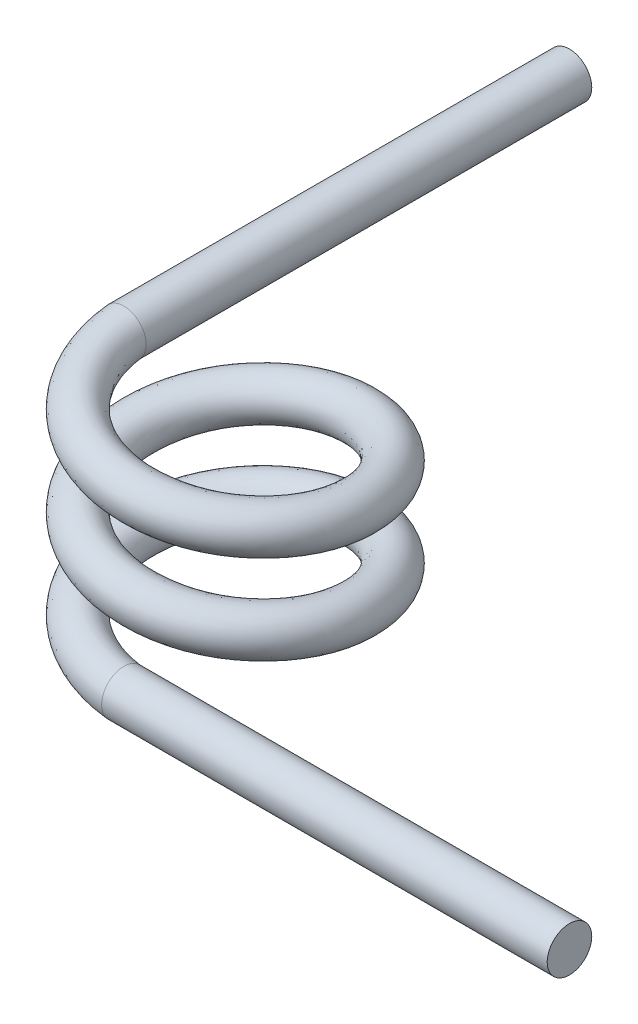
ISO-10303-21;
HEADER;
FILE_DESCRIPTION(('STEP AP214'),'2;1');
FILE_NAME('part.step','',(''),(''),'','','');
FILE_SCHEMA(('AUTOMOTIVE_DESIGN { 1 0 10303 214 1 1 1 1 }'));
ENDSEC;
DATA;
#1=APPLICATION_CONTEXT('core data for automotive mechanical design processes');
#2=APPLICATION_PROTOCOL_DEFINITION('international standard','automotive_design',2000,#1);
#3=PRODUCT_CONTEXT('',#1,'mechanical');
#4=PRODUCT('Part','Part','',(#3));
#5=PRODUCT_RELATED_PRODUCT_CATEGORY('part','',(#4));
#6=PRODUCT_DEFINITION_FORMATION('','',#4);
#7=PRODUCT_DEFINITION_CONTEXT('part definition',#1,'design');
#8=PRODUCT_DEFINITION('design','',#6,#7);
#9=PRODUCT_DEFINITION_SHAPE('','',#8);
#10=(LENGTH_UNIT() NAMED_UNIT(*) SI_UNIT(.MILLI.,.METRE.));
#11=(NAMED_UNIT(*) PLANE_ANGLE_UNIT() SI_UNIT($,.RADIAN.));
#12=(NAMED_UNIT(*) SI_UNIT($,.STERADIAN.) SOLID_ANGLE_UNIT());
#13=UNCERTAINTY_MEASURE_WITH_UNIT(LENGTH_MEASURE(1.E-05),#10,'distance_accuracy_value','');
#14=(GEOMETRIC_REPRESENTATION_CONTEXT(3) GLOBAL_UNCERTAINTY_ASSIGNED_CONTEXT((#13)) GLOBAL_UNIT_ASSIGNED_CONTEXT((#10,
#11,#12)) REPRESENTATION_CONTEXT('',''));
#15=CARTESIAN_POINT('',(0.,0.,0.));
#16=DIRECTION('',(0.,0.,1.));
#17=DIRECTION('',(1.,0.,0.));
#18=AXIS2_PLACEMENT_3D('',#15,#16,#17);
#19=CARTESIAN_POINT('',(0.999999999999999,0.,0.));
#20=CARTESIAN_POINT('',(1.00000000000001,0.0625000000000017,0.414213562373059));
#21=CARTESIAN_POINT('',(0.707106781186572,0.125000000000002,0.707106781186521));
#22=CARTESIAN_POINT('',(0.41421356237313,0.187500000000002,0.999999999999984));
#23=CARTESIAN_POINT('',(0.,0.250000000000002,0.999999999999999));
#24=CARTESIAN_POINT('',(-0.414213562373059,0.312500000000002,1.00000000000001));
#25=CARTESIAN_POINT('',(-0.707106781186521,0.375000000000002,0.707106781186572));
#26=CARTESIAN_POINT('',(-0.999999999999984,0.437500000000002,0.41421356237313));
#27=CARTESIAN_POINT('',(-0.999999999999999,0.500000000000002,0.));
#28=CARTESIAN_POINT('',(-1.00000000000001,0.562500000000002,-0.414213562373059));
#29=CARTESIAN_POINT('',(-0.707106781186572,0.625000000000002,-0.707106781186521));
#30=CARTESIAN_POINT('',(-0.414213562373131,0.687500000000002,-0.999999999999984));
#31=CARTESIAN_POINT('',(0.,0.750000000000002,-0.999999999999999));
#32=CARTESIAN_POINT('',(0.414213562373059,0.812500000000002,-1.00000000000001));
#33=CARTESIAN_POINT('',(0.707106781186521,0.875000000000002,-0.707106781186572));
#34=CARTESIAN_POINT('',(0.999999999999984,0.937500000000002,-0.414213562373131));
#35=CARTESIAN_POINT('',(0.999999999999999,1.,0.));
#36=CARTESIAN_POINT('',(1.00000000000001,1.0625,0.414213562373059));
#37=CARTESIAN_POINT('',(0.707106781186572,1.125,0.707106781186521));
#38=CARTESIAN_POINT('',(0.41421356237313,1.1875,0.999999999999984));
#39=CARTESIAN_POINT('',(0.,1.25,0.999999999999999));
#40=CARTESIAN_POINT('',(-0.414213562373059,1.3125,1.00000000000001));
#41=CARTESIAN_POINT('',(-0.707106781186521,1.375,0.707106781186572));
#42=CARTESIAN_POINT('',(-0.999999999999984,1.4375,0.41421356237313));
#43=CARTESIAN_POINT('',(-0.999999999999999,1.5,0.));
#44=CARTESIAN_POINT('',(-1.00000000000001,1.5625,-0.414213562373059));
#45=CARTESIAN_POINT('',(-0.707106781186572,1.625,-0.707106781186521));
#46=CARTESIAN_POINT('',(-0.414213562373131,1.6875,-0.999999999999984));
#47=CARTESIAN_POINT('',(0.,1.75,-0.999999999999999));
#48=CARTESIAN_POINT('',(0.414213562373059,1.8125,-1.00000000000001));
#49=CARTESIAN_POINT('',(0.707106781186521,1.875,-0.707106781186572));
#50=CARTESIAN_POINT('',(0.999999999999984,1.9375,-0.414213562373131));
#51=CARTESIAN_POINT('',(0.999999999999999,2.,0.));
#52=CARTESIAN_POINT('',(1.00000000000001,2.0625,0.414213562373059));
#53=CARTESIAN_POINT('',(0.707106781186572,2.125,0.707106781186521));
#54=CARTESIAN_POINT('',(0.41421356237313,2.1875,0.999999999999984));
#55=CARTESIAN_POINT('',(0.,2.25,0.999999999999999));
#56=CARTESIAN_POINT('',(-0.414213562373059,2.3125,1.00000000000001));
#57=CARTESIAN_POINT('',(-0.707106781186521,2.375,0.707106781186572));
#58=CARTESIAN_POINT('',(-0.999999999999984,2.4375,0.41421356237313));
#59=CARTESIAN_POINT('',(-0.999999999999999,2.5,0.));
#60=CARTESIAN_POINT('',(0.999999999999999,0.500000000000002,0.));
#61=CARTESIAN_POINT('',(1.00000000000001,0.562500000000002,0.414213562373059));
#62=CARTESIAN_POINT('',(0.707106781186572,0.625000000000002,0.707106781186521));
#63=CARTESIAN_POINT('',(0.41421356237313,0.687500000000002,0.999999999999984));
#64=CARTESIAN_POINT('',(0.,0.750000000000002,0.999999999999999));
#65=CARTESIAN_POINT('',(-0.414213562373059,0.812500000000002,1.00000000000001));
#66=CARTESIAN_POINT('',(-0.707106781186521,0.875000000000002,0.707106781186572));
#67=CARTESIAN_POINT('',(-0.999999999999984,0.937500000000002,0.41421356237313));
#68=CARTESIAN_POINT('',(-0.999999999999999,1.,0.));
#69=CARTESIAN_POINT('',(-1.00000000000001,1.0625,-0.414213562373059));
#70=CARTESIAN_POINT('',(-0.707106781186572,1.125,-0.707106781186521));
#71=CARTESIAN_POINT('',(-0.414213562373131,1.1875,-0.999999999999984));
#72=CARTESIAN_POINT('',(0.,1.25,-0.999999999999999));
#73=CARTESIAN_POINT('',(0.414213562373059,1.3125,-1.00000000000001));
#74=CARTESIAN_POINT('',(0.707106781186521,1.375,-0.707106781186572));
#75=CARTESIAN_POINT('',(0.999999999999984,1.4375,-0.414213562373131));
#76=CARTESIAN_POINT('',(0.999999999999999,1.5,0.));
#77=CARTESIAN_POINT('',(1.00000000000001,1.5625,0.414213562373059));
#78=CARTESIAN_POINT('',(0.707106781186572,1.625,0.707106781186521));
#79=CARTESIAN_POINT('',(0.41421356237313,1.6875,0.999999999999984));
#80=CARTESIAN_POINT('',(0.,1.75,0.999999999999999));
#81=CARTESIAN_POINT('',(-0.414213562373059,1.8125,1.00000000000001));
#82=CARTESIAN_POINT('',(-0.707106781186521,1.875,0.707106781186572));
#83=CARTESIAN_POINT('',(-0.999999999999984,1.9375,0.41421356237313));
#84=CARTESIAN_POINT('',(-0.999999999999999,2.,0.));
#85=CARTESIAN_POINT('',(-1.00000000000001,2.0625,-0.414213562373059));
#86=CARTESIAN_POINT('',(-0.707106781186572,2.125,-0.707106781186521));
#87=CARTESIAN_POINT('',(-0.414213562373131,2.1875,-0.999999999999984));
#88=CARTESIAN_POINT('',(0.,2.25,-0.999999999999999));
#89=CARTESIAN_POINT('',(0.414213562373059,2.3125,-1.00000000000001));
#90=CARTESIAN_POINT('',(0.707106781186521,2.375,-0.707106781186572));
#91=CARTESIAN_POINT('',(0.999999999999984,2.4375,-0.414213562373131));
#92=CARTESIAN_POINT('',(0.999999999999999,2.5,0.));
#93=CARTESIAN_POINT('',(1.00000000000001,2.5625,0.414213562373059));
#94=CARTESIAN_POINT('',(0.707106781186572,2.625,0.707106781186521));
#95=CARTESIAN_POINT('',(0.41421356237313,2.6875,0.999999999999984));
#96=CARTESIAN_POINT('',(0.,2.75,0.999999999999999));
#97=CARTESIAN_POINT('',(-0.414213562373059,2.8125,1.00000000000001));
#98=CARTESIAN_POINT('',(-0.707106781186521,2.875,0.707106781186572));
#99=CARTESIAN_POINT('',(-0.999999999999984,2.9375,0.41421356237313));
#100=CARTESIAN_POINT('',(-0.999999999999999,3.,0.));
#101=CARTESIAN_POINT('',(1.5,0.500000000000002,0.));
#102=CARTESIAN_POINT('',(1.50000000000002,0.562500000000002,0.621320343559591));
#103=CARTESIAN_POINT('',(1.06066017177986,0.625000000000002,1.06066017177978));
#104=CARTESIAN_POINT('',(0.621320343559694,0.687500000000002,1.49999999999998));
#105=CARTESIAN_POINT('',(0.,0.750000000000002,1.5));
#106=CARTESIAN_POINT('',(-0.621320343559591,0.812500000000002,1.50000000000002));
#107=CARTESIAN_POINT('',(-1.06066017177978,0.875000000000002,1.06066017177986));
#108=CARTESIAN_POINT('',(-1.49999999999998,0.937500000000002,0.621320343559694));
#109=CARTESIAN_POINT('',(-1.5,1.,0.));
#110=CARTESIAN_POINT('',(-1.50000000000002,1.0625,-0.62132034355959));
#111=CARTESIAN_POINT('',(-1.06066017177986,1.125,-1.06066017177978));
#112=CARTESIAN_POINT('',(-0.621320343559694,1.1875,-1.49999999999998));
#113=CARTESIAN_POINT('',(0.,1.25,-1.5));
#114=CARTESIAN_POINT('',(0.621320343559591,1.3125,-1.50000000000002));
#115=CARTESIAN_POINT('',(1.06066017177978,1.375,-1.06066017177986));
#116=CARTESIAN_POINT('',(1.49999999999998,1.4375,-0.621320343559695));
#117=CARTESIAN_POINT('',(1.5,1.5,0.));
#118=CARTESIAN_POINT('',(1.50000000000002,1.5625,0.621320343559591));
#119=CARTESIAN_POINT('',(1.06066017177986,1.625,1.06066017177978));
#120=CARTESIAN_POINT('',(0.621320343559694,1.6875,1.49999999999998));
#121=CARTESIAN_POINT('',(0.,1.75,1.5));
#122=CARTESIAN_POINT('',(-0.621320343559591,1.8125,1.50000000000002));
#123=CARTESIAN_POINT('',(-1.06066017177978,1.875,1.06066017177986));
#124=CARTESIAN_POINT('',(-1.49999999999998,1.9375,0.621320343559694));
#125=CARTESIAN_POINT('',(-1.5,2.,0.));
#126=CARTESIAN_POINT('',(-1.50000000000002,2.0625,-0.62132034355959));
#127=CARTESIAN_POINT('',(-1.06066017177986,2.125,-1.06066017177978));
#128=CARTESIAN_POINT('',(-0.621320343559694,2.1875,-1.49999999999998));
#129=CARTESIAN_POINT('',(0.,2.25,-1.5));
#130=CARTESIAN_POINT('',(0.621320343559591,2.3125,-1.50000000000002));
#131=CARTESIAN_POINT('',(1.06066017177978,2.375,-1.06066017177986));
#132=CARTESIAN_POINT('',(1.49999999999998,2.4375,-0.621320343559695));
#133=CARTESIAN_POINT('',(1.5,2.5,0.));
#134=CARTESIAN_POINT('',(1.50000000000002,2.5625,0.621320343559591));
#135=CARTESIAN_POINT('',(1.06066017177986,2.625,1.06066017177978));
#136=CARTESIAN_POINT('',(0.621320343559694,2.6875,1.49999999999998));
#137=CARTESIAN_POINT('',(0.,2.75,1.5));
#138=CARTESIAN_POINT('',(-0.621320343559591,2.8125,1.50000000000002));
#139=CARTESIAN_POINT('',(-1.06066017177978,2.875,1.06066017177986));
#140=CARTESIAN_POINT('',(-1.49999999999998,2.9375,0.621320343559694));
#141=CARTESIAN_POINT('',(-1.5,3.,0.));
#142=CARTESIAN_POINT('',(1.5,0.,0.));
#143=CARTESIAN_POINT('',(1.50000000000002,0.0625000000000018,0.62132034355959));
#144=CARTESIAN_POINT('',(1.06066017177986,0.125000000000002,1.06066017177978));
#145=CARTESIAN_POINT('',(0.621320343559694,0.187500000000002,1.49999999999998));
#146=CARTESIAN_POINT('',(0.,0.250000000000002,1.5));
#147=CARTESIAN_POINT('',(-0.62132034355959,0.312500000000002,1.50000000000002));
#148=CARTESIAN_POINT('',(-1.06066017177978,0.375000000000002,1.06066017177986));
#149=CARTESIAN_POINT('',(-1.49999999999998,0.437500000000002,0.621320343559694));
#150=CARTESIAN_POINT('',(-1.5,0.500000000000002,0.));
#151=CARTESIAN_POINT('',(-1.50000000000002,0.562500000000002,-0.62132034355959));
#152=CARTESIAN_POINT('',(-1.06066017177986,0.625000000000002,-1.06066017177978));
#153=CARTESIAN_POINT('',(-0.621320343559694,0.687500000000002,-1.49999999999998));
#154=CARTESIAN_POINT('',(0.,0.750000000000002,-1.5));
#155=CARTESIAN_POINT('',(0.621320343559591,0.812500000000002,-1.50000000000002));
#156=CARTESIAN_POINT('',(1.06066017177978,0.875000000000002,-1.06066017177986));
#157=CARTESIAN_POINT('',(1.49999999999998,0.937500000000002,-0.621320343559695));
#158=CARTESIAN_POINT('',(1.5,1.,0.));
#159=CARTESIAN_POINT('',(1.50000000000002,1.0625,0.62132034355959));
#160=CARTESIAN_POINT('',(1.06066017177986,1.125,1.06066017177978));
#161=CARTESIAN_POINT('',(0.621320343559694,1.1875,1.49999999999998));
#162=CARTESIAN_POINT('',(0.,1.25,1.5));
#163=CARTESIAN_POINT('',(-0.62132034355959,1.3125,1.50000000000002));
#164=CARTESIAN_POINT('',(-1.06066017177978,1.375,1.06066017177986));
#165=CARTESIAN_POINT('',(-1.49999999999998,1.4375,0.621320343559694));
#166=CARTESIAN_POINT('',(-1.5,1.5,0.));
#167=CARTESIAN_POINT('',(-1.50000000000002,1.5625,-0.62132034355959));
#168=CARTESIAN_POINT('',(-1.06066017177986,1.625,-1.06066017177978));
#169=CARTESIAN_POINT('',(-0.621320343559694,1.6875,-1.49999999999998));
#170=CARTESIAN_POINT('',(0.,1.75,-1.5));
#171=CARTESIAN_POINT('',(0.621320343559591,1.8125,-1.50000000000002));
#172=CARTESIAN_POINT('',(1.06066017177978,1.875,-1.06066017177986));
#173=CARTESIAN_POINT('',(1.49999999999998,1.9375,-0.621320343559695));
#174=CARTESIAN_POINT('',(1.5,2.,0.));
#175=CARTESIAN_POINT('',(1.50000000000002,2.0625,0.62132034355959));
#176=CARTESIAN_POINT('',(1.06066017177986,2.125,1.06066017177978));
#177=CARTESIAN_POINT('',(0.621320343559694,2.1875,1.49999999999998));
#178=CARTESIAN_POINT('',(0.,2.25,1.5));
#179=CARTESIAN_POINT('',(-0.62132034355959,2.3125,1.50000000000002));
#180=CARTESIAN_POINT('',(-1.06066017177978,2.375,1.06066017177986));
#181=CARTESIAN_POINT('',(-1.49999999999998,2.4375,0.621320343559694));
#182=CARTESIAN_POINT('',(-1.5,2.5,0.));
#183=CARTESIAN_POINT('',(1.5,-0.499999999999998,0.));
#184=CARTESIAN_POINT('',(1.50000000000002,-0.437499999999998,0.621320343559591));
#185=CARTESIAN_POINT('',(1.06066017177986,-0.374999999999998,1.06066017177978));
#186=CARTESIAN_POINT('',(0.621320343559694,-0.312499999999998,1.49999999999998));
#187=CARTESIAN_POINT('',(0.,-0.249999999999998,1.5));
#188=CARTESIAN_POINT('',(-0.621320343559591,-0.187499999999998,1.50000000000002));
#189=CARTESIAN_POINT('',(-1.06066017177978,-0.124999999999998,1.06066017177986));
#190=CARTESIAN_POINT('',(-1.49999999999998,-0.0624999999999982,0.621320343559694));
#191=CARTESIAN_POINT('',(-1.5,0.,0.));
#192=CARTESIAN_POINT('',(-1.50000000000002,0.0625000000000019,-0.62132034355959));
#193=CARTESIAN_POINT('',(-1.06066017177986,0.125000000000002,-1.06066017177978));
#194=CARTESIAN_POINT('',(-0.621320343559694,0.187500000000002,-1.49999999999998));
#195=CARTESIAN_POINT('',(0.,0.250000000000002,-1.5));
#196=CARTESIAN_POINT('',(0.621320343559591,0.312500000000002,-1.50000000000002));
#197=CARTESIAN_POINT('',(1.06066017177978,0.375000000000002,-1.06066017177986));
#198=CARTESIAN_POINT('',(1.49999999999998,0.437500000000002,-0.621320343559695));
#199=CARTESIAN_POINT('',(1.5,0.500000000000002,0.));
#200=CARTESIAN_POINT('',(1.50000000000002,0.562500000000002,0.621320343559591));
#201=CARTESIAN_POINT('',(1.06066017177986,0.625000000000002,1.06066017177978));
#202=CARTESIAN_POINT('',(0.621320343559694,0.687500000000002,1.49999999999998));
#203=CARTESIAN_POINT('',(0.,0.750000000000002,1.5));
#204=CARTESIAN_POINT('',(-0.621320343559591,0.812500000000002,1.50000000000002));
#205=CARTESIAN_POINT('',(-1.06066017177978,0.875000000000002,1.06066017177986));
#206=CARTESIAN_POINT('',(-1.49999999999998,0.937500000000002,0.621320343559694));
#207=CARTESIAN_POINT('',(-1.5,1.,0.));
#208=CARTESIAN_POINT('',(-1.50000000000002,1.0625,-0.62132034355959));
#209=CARTESIAN_POINT('',(-1.06066017177986,1.125,-1.06066017177978));
#210=CARTESIAN_POINT('',(-0.621320343559694,1.1875,-1.49999999999998));
#211=CARTESIAN_POINT('',(0.,1.25,-1.5));
#212=CARTESIAN_POINT('',(0.621320343559591,1.3125,-1.50000000000002));
#213=CARTESIAN_POINT('',(1.06066017177978,1.375,-1.06066017177986));
#214=CARTESIAN_POINT('',(1.49999999999998,1.4375,-0.621320343559695));
#215=CARTESIAN_POINT('',(1.5,1.5,0.));
#216=CARTESIAN_POINT('',(1.50000000000002,1.5625,0.621320343559591));
#217=CARTESIAN_POINT('',(1.06066017177986,1.625,1.06066017177978));
#218=CARTESIAN_POINT('',(0.621320343559694,1.6875,1.49999999999998));
#219=CARTESIAN_POINT('',(0.,1.75,1.5));
#220=CARTESIAN_POINT('',(-0.621320343559591,1.8125,1.50000000000002));
#221=CARTESIAN_POINT('',(-1.06066017177978,1.875,1.06066017177986));
#222=CARTESIAN_POINT('',(-1.49999999999998,1.9375,0.621320343559694));
#223=CARTESIAN_POINT('',(-1.5,2.,0.));
#224=CARTESIAN_POINT('',(0.999999999999999,-0.499999999999998,0.));
#225=CARTESIAN_POINT('',(1.00000000000001,-0.437499999999998,0.414213562373059));
#226=CARTESIAN_POINT('',(0.707106781186572,-0.374999999999998,0.707106781186521));
#227=CARTESIAN_POINT('',(0.41421356237313,-0.312499999999998,0.999999999999984));
#228=CARTESIAN_POINT('',(0.,-0.249999999999998,0.999999999999999));
#229=CARTESIAN_POINT('',(-0.414213562373059,-0.187499999999998,1.00000000000001));
#230=CARTESIAN_POINT('',(-0.707106781186521,-0.124999999999998,0.707106781186572));
#231=CARTESIAN_POINT('',(-0.999999999999984,-0.0624999999999982,0.41421356237313));
#232=CARTESIAN_POINT('',(-0.999999999999999,0.,0.));
#233=CARTESIAN_POINT('',(-1.00000000000001,0.0625000000000019,-0.414213562373059));
#234=CARTESIAN_POINT('',(-0.707106781186572,0.125000000000002,-0.707106781186521));
#235=CARTESIAN_POINT('',(-0.414213562373131,0.187500000000002,-0.999999999999984));
#236=CARTESIAN_POINT('',(0.,0.250000000000002,-0.999999999999999));
#237=CARTESIAN_POINT('',(0.414213562373059,0.312500000000002,-1.00000000000001));
#238=CARTESIAN_POINT('',(0.707106781186521,0.375000000000002,-0.707106781186572));
#239=CARTESIAN_POINT('',(0.999999999999984,0.437500000000002,-0.414213562373131));
#240=CARTESIAN_POINT('',(0.999999999999999,0.500000000000002,0.));
#241=CARTESIAN_POINT('',(1.00000000000001,0.562500000000002,0.414213562373059));
#242=CARTESIAN_POINT('',(0.707106781186572,0.625000000000002,0.707106781186521));
#243=CARTESIAN_POINT('',(0.41421356237313,0.687500000000002,0.999999999999984));
#244=CARTESIAN_POINT('',(0.,0.750000000000002,0.999999999999999));
#245=CARTESIAN_POINT('',(-0.414213562373059,0.812500000000002,1.00000000000001));
#246=CARTESIAN_POINT('',(-0.707106781186521,0.875000000000002,0.707106781186572));
#247=CARTESIAN_POINT('',(-0.999999999999984,0.937500000000002,0.41421356237313));
#248=CARTESIAN_POINT('',(-0.999999999999999,1.,0.));
#249=CARTESIAN_POINT('',(-1.00000000000001,1.0625,-0.414213562373059));
#250=CARTESIAN_POINT('',(-0.707106781186572,1.125,-0.707106781186521));
#251=CARTESIAN_POINT('',(-0.414213562373131,1.1875,-0.999999999999984));
#252=CARTESIAN_POINT('',(0.,1.25,-0.999999999999999));
#253=CARTESIAN_POINT('',(0.414213562373059,1.3125,-1.00000000000001));
#254=CARTESIAN_POINT('',(0.707106781186521,1.375,-0.707106781186572));
#255=CARTESIAN_POINT('',(0.999999999999984,1.4375,-0.414213562373131));
#256=CARTESIAN_POINT('',(0.999999999999999,1.5,0.));
#257=CARTESIAN_POINT('',(1.00000000000001,1.5625,0.414213562373059));
#258=CARTESIAN_POINT('',(0.707106781186572,1.625,0.707106781186521));
#259=CARTESIAN_POINT('',(0.41421356237313,1.6875,0.999999999999984));
#260=CARTESIAN_POINT('',(0.,1.75,0.999999999999999));
#261=CARTESIAN_POINT('',(-0.414213562373059,1.8125,1.00000000000001));
#262=CARTESIAN_POINT('',(-0.707106781186521,1.875,0.707106781186572));
#263=CARTESIAN_POINT('',(-0.999999999999984,1.9375,0.41421356237313));
#264=CARTESIAN_POINT('',(-0.999999999999999,2.,0.));
#265=CARTESIAN_POINT('',(0.999999999999999,0.,0.));
#266=CARTESIAN_POINT('',(1.00000000000001,0.0625000000000017,0.414213562373059));
#267=CARTESIAN_POINT('',(0.707106781186572,0.125000000000002,0.707106781186521));
#268=CARTESIAN_POINT('',(0.41421356237313,0.187500000000002,0.999999999999984));
#269=CARTESIAN_POINT('',(0.,0.250000000000002,0.999999999999999));
#270=CARTESIAN_POINT('',(-0.414213562373059,0.312500000000002,1.00000000000001));
#271=CARTESIAN_POINT('',(-0.707106781186521,0.375000000000002,0.707106781186572));
#272=CARTESIAN_POINT('',(-0.999999999999984,0.437500000000002,0.41421356237313));
#273=CARTESIAN_POINT('',(-0.999999999999999,0.500000000000002,0.));
#274=CARTESIAN_POINT('',(-1.00000000000001,0.562500000000002,-0.414213562373059));
#275=CARTESIAN_POINT('',(-0.707106781186572,0.625000000000002,-0.707106781186521));
#276=CARTESIAN_POINT('',(-0.414213562373131,0.687500000000002,-0.999999999999984));
#277=CARTESIAN_POINT('',(0.,0.750000000000002,-0.999999999999999));
#278=CARTESIAN_POINT('',(0.414213562373059,0.812500000000002,-1.00000000000001));
#279=CARTESIAN_POINT('',(0.707106781186521,0.875000000000002,-0.707106781186572));
#280=CARTESIAN_POINT('',(0.999999999999984,0.937500000000002,-0.414213562373131));
#281=CARTESIAN_POINT('',(0.999999999999999,1.,0.));
#282=CARTESIAN_POINT('',(1.00000000000001,1.0625,0.414213562373059));
#283=CARTESIAN_POINT('',(0.707106781186572,1.125,0.707106781186521));
#284=CARTESIAN_POINT('',(0.41421356237313,1.1875,0.999999999999984));
#285=CARTESIAN_POINT('',(0.,1.25,0.999999999999999));
#286=CARTESIAN_POINT('',(-0.414213562373059,1.3125,1.00000000000001));
#287=CARTESIAN_POINT('',(-0.707106781186521,1.375,0.707106781186572));
#288=CARTESIAN_POINT('',(-0.999999999999984,1.4375,0.41421356237313));
#289=CARTESIAN_POINT('',(-0.999999999999999,1.5,0.));
#290=CARTESIAN_POINT('',(-1.00000000000001,1.5625,-0.414213562373059));
#291=CARTESIAN_POINT('',(-0.707106781186572,1.625,-0.707106781186521));
#292=CARTESIAN_POINT('',(-0.414213562373131,1.6875,-0.999999999999984));
#293=CARTESIAN_POINT('',(0.,1.75,-0.999999999999999));
#294=CARTESIAN_POINT('',(0.414213562373059,1.8125,-1.00000000000001));
#295=CARTESIAN_POINT('',(0.707106781186521,1.875,-0.707106781186572));
#296=CARTESIAN_POINT('',(0.999999999999984,1.9375,-0.414213562373131));
#297=CARTESIAN_POINT('',(0.999999999999999,2.,0.));
#298=CARTESIAN_POINT('',(1.00000000000001,2.0625,0.414213562373059));
#299=CARTESIAN_POINT('',(0.707106781186572,2.125,0.707106781186521));
#300=CARTESIAN_POINT('',(0.41421356237313,2.1875,0.999999999999984));
#301=CARTESIAN_POINT('',(0.,2.25,0.999999999999999));
#302=CARTESIAN_POINT('',(-0.414213562373059,2.3125,1.00000000000001));
#303=CARTESIAN_POINT('',(-0.707106781186521,2.375,0.707106781186572));
#304=CARTESIAN_POINT('',(-0.999999999999984,2.4375,0.41421356237313));
#305=CARTESIAN_POINT('',(-0.999999999999999,2.5,0.));
#306=(BOUNDED_SURFACE() B_SPLINE_SURFACE(3,2,((#19,#20,#21,#22,#23,#24,#25,#26,#27,#28,#29,#30,
#31,#32,#33,#34,#35,#36,#37,#38,#39,#40,#41,#42,#43,#44,#45,#46,#47,#48,#49,#50,#51,#52,#53,#54,
#55,#56,#57,#58,#59),(#60,#61,#62,#63,#64,#65,#66,#67,#68,#69,#70,#71,#72,#73,#74,#75,#76,#77,
#78,#79,#80,#81,#82,#83,#84,#85,#86,#87,#88,#89,#90,#91,#92,#93,#94,#95,#96,#97,#98,#99,#100),
(#101,#102,#103,#104,#105,#106,#107,#108,#109,#110,#111,#112,#113,#114,#115,#116,#117,#118,#119,
#120,#121,#122,#123,#124,#125,#126,#127,#128,#129,#130,#131,#132,#133,#134,#135,#136,#137,#138,
#139,#140,#141),(#142,#143,#144,#145,#146,#147,#148,#149,#150,#151,#152,#153,#154,#155,#156,
#157,#158,#159,#160,#161,#162,#163,#164,#165,#166,#167,#168,#169,#170,#171,#172,#173,#174,#175,
#176,#177,#178,#179,#180,#181,#182),(#183,#184,#185,#186,#187,#188,#189,#190,#191,#192,#193,
#194,#195,#196,#197,#198,#199,#200,#201,#202,#203,#204,#205,#206,#207,#208,#209,#210,#211,#212,
#213,#214,#215,#216,#217,#218,#219,#220,#221,#222,#223),(#224,#225,#226,#227,#228,#229,#230,
#231,#232,#233,#234,#235,#236,#237,#238,#239,#240,#241,#242,#243,#244,#245,#246,#247,#248,#249,
#250,#251,#252,#253,#254,#255,#256,#257,#258,#259,#260,#261,#262,#263,#264),(#265,#266,#267,
#268,#269,#270,#271,#272,#273,#274,#275,#276,#277,#278,#279,#280,#281,#282,#283,#284,#285,#286,
#287,#288,#289,#290,#291,#292,#293,#294,#295,#296,#297,#298,#299,#300,#301,#302,#303,#304,
#305)),.UNSPECIFIED.,.T.,.F.,.F.) B_SPLINE_SURFACE_WITH_KNOTS((4,3,4),(3,2,2,2,2,2,2,2,2,2,2,2,
2,2,2,2,2,2,2,2,3),(0.,0.5,1.),(0.,0.0416666666666667,0.0833333333333333,0.125,
0.166666666666667,0.208333333333333,0.25,0.291666666666667,0.333333333333333,0.375,
0.416666666666667,0.458333333333333,0.5,0.541666666666667,0.583333333333333,0.625,
0.666666666666667,0.708333333333333,0.75,0.791666666666667,0.833333333333333),
.UNSPECIFIED.) GEOMETRIC_REPRESENTATION_ITEM() RATIONAL_B_SPLINE_SURFACE(((1.,0.923879532511287,
1.,0.923879532511287,1.,0.923879532511287,1.,0.923879532511287,1.,0.923879532511287,1.,
0.923879532511287,1.,0.923879532511287,1.,0.923879532511287,1.,0.923879532511287,1.,
0.923879532511287,1.,0.923879532511287,1.,0.923879532511287,1.,0.923879532511287,1.,
0.923879532511287,1.,0.923879532511287,1.,0.923879532511287,1.,0.923879532511287,1.,
0.923879532511287,1.,0.923879532511287,1.,0.923879532511287,1.),(0.333333333333333,
0.307959844170429,0.333333333333333,0.307959844170429,0.333333333333333,0.307959844170429,
0.333333333333333,0.307959844170429,0.333333333333333,0.307959844170429,0.333333333333333,
0.307959844170429,0.333333333333333,0.307959844170429,0.333333333333333,0.307959844170429,
0.333333333333333,0.307959844170429,0.333333333333333,0.307959844170429,0.333333333333333,
0.307959844170429,0.333333333333333,0.307959844170429,0.333333333333333,0.307959844170429,
0.333333333333333,0.307959844170429,0.333333333333333,0.307959844170429,0.333333333333333,
0.307959844170429,0.333333333333333,0.307959844170429,0.333333333333333,0.307959844170429,
0.333333333333333,0.307959844170429,0.333333333333333,0.307959844170429,0.333333333333333),
(0.333333333333333,0.307959844170429,0.333333333333333,0.307959844170429,0.333333333333333,
0.307959844170429,0.333333333333333,0.307959844170429,0.333333333333333,0.307959844170429,
0.333333333333333,0.307959844170429,0.333333333333333,0.307959844170429,0.333333333333333,
0.307959844170429,0.333333333333333,0.307959844170429,0.333333333333333,0.307959844170429,
0.333333333333333,0.307959844170429,0.333333333333333,0.307959844170429,0.333333333333333,
0.307959844170429,0.333333333333333,0.307959844170429,0.333333333333333,0.307959844170429,
0.333333333333333,0.307959844170429,0.333333333333333,0.307959844170429,0.333333333333333,
0.307959844170429,0.333333333333333,0.307959844170429,0.333333333333333,0.307959844170429,
0.333333333333333),(1.,0.923879532511287,1.,0.923879532511287,1.,0.923879532511287,1.,
0.923879532511287,1.,0.923879532511287,1.,0.923879532511287,1.,0.923879532511287,1.,
0.923879532511287,1.,0.923879532511287,1.,0.923879532511287,1.,0.923879532511287,1.,
0.923879532511287,1.,0.923879532511287,1.,0.923879532511287,1.,0.923879532511287,1.,
0.923879532511287,1.,0.923879532511287,1.,0.923879532511287,1.,0.923879532511287,1.,
0.923879532511287,1.),(0.333333333333333,0.307959844170429,0.333333333333333,0.307959844170429,
0.333333333333333,0.307959844170429,0.333333333333333,0.307959844170429,0.333333333333333,
0.307959844170429,0.333333333333333,0.307959844170429,0.333333333333333,0.307959844170429,
0.333333333333333,0.307959844170429,0.333333333333333,0.307959844170429,0.333333333333333,
0.307959844170429,0.333333333333333,0.307959844170429,0.333333333333333,0.307959844170429,
0.333333333333333,0.307959844170429,0.333333333333333,0.307959844170429,0.333333333333333,
0.307959844170429,0.333333333333333,0.307959844170429,0.333333333333333,0.307959844170429,
0.333333333333333,0.307959844170429,0.333333333333333,0.307959844170429,0.333333333333333,
0.307959844170429,0.333333333333333),(0.333333333333333,0.307959844170429,0.333333333333333,
0.307959844170429,0.333333333333333,0.307959844170429,0.333333333333333,0.307959844170429,
0.333333333333333,0.307959844170429,0.333333333333333,0.307959844170429,0.333333333333333,
0.307959844170429,0.333333333333333,0.307959844170429,0.333333333333333,0.307959844170429,
0.333333333333333,0.307959844170429,0.333333333333333,0.307959844170429,0.333333333333333,
0.307959844170429,0.333333333333333,0.307959844170429,0.333333333333333,0.307959844170429,
0.333333333333333,0.307959844170429,0.333333333333333,0.307959844170429,0.333333333333333,
0.307959844170429,0.333333333333333,0.307959844170429,0.333333333333333,0.307959844170429,
0.333333333333333,0.307959844170429,0.333333333333333),(1.,0.923879532511287,1.,
0.923879532511287,1.,0.923879532511287,1.,0.923879532511287,1.,0.923879532511287,1.,
0.923879532511287,1.,0.923879532511287,1.,0.923879532511287,1.,0.923879532511287,1.,
0.923879532511287,1.,0.923879532511287,1.,0.923879532511287,1.,0.923879532511287,1.,
0.923879532511287,1.,0.923879532511287,1.,0.923879532511287,1.,0.923879532511287,1.,
0.923879532511287,1.,0.923879532511287,1.,0.923879532511287,1.))) REPRESENTATION_ITEM('') SURFACE());
#307=CARTESIAN_POINT('',(-0.999999999999999,2.5,0.));
#308=CARTESIAN_POINT('',(-0.999999999999999,3.,0.));
#309=CARTESIAN_POINT('',(-1.5,3.,0.));
#310=CARTESIAN_POINT('',(-1.5,2.5,0.));
#311=CARTESIAN_POINT('',(-1.5,2.,0.));
#312=CARTESIAN_POINT('',(-0.999999999999999,2.,0.));
#313=CARTESIAN_POINT('',(-0.999999999999999,2.5,0.));
#314=(BOUNDED_CURVE() B_SPLINE_CURVE(3,(#307,#308,#309,#310,#311,#312,#313),.UNSPECIFIED.,.T.,
.F.) B_SPLINE_CURVE_WITH_KNOTS((4,3,4),(0.,0.5,1.),
.UNSPECIFIED.) CURVE() GEOMETRIC_REPRESENTATION_ITEM() RATIONAL_B_SPLINE_CURVE((1.,
0.333333333333333,0.333333333333333,1.,0.333333333333333,0.333333333333333,1.)) REPRESENTATION_ITEM(''));
#315=CARTESIAN_POINT('',(-1.49969549380807,2.48766466976761,0.));
#316=VERTEX_POINT('',#315);
#317=CARTESIAN_POINT('',(-1.00022163381618,2.51052462762006,0.));
#318=VERTEX_POINT('',#317);
#319=EDGE_CURVE('E60',#316,#318,#314,.F.);
#320=CARTESIAN_POINT('',(-0.999999999999999,2.5,0.));
#321=CARTESIAN_POINT('',(-0.999999999999999,3.,0.));
#322=CARTESIAN_POINT('',(-1.5,3.,0.));
#323=CARTESIAN_POINT('',(-1.5,2.5,0.));
#324=CARTESIAN_POINT('',(-1.5,2.,0.));
#325=CARTESIAN_POINT('',(-0.999999999999999,2.,0.));
#326=CARTESIAN_POINT('',(-0.999999999999999,2.5,0.));
#327=(BOUNDED_CURVE() B_SPLINE_CURVE(3,(#320,#321,#322,#323,#324,#325,#326),.UNSPECIFIED.,.T.,
.F.) B_SPLINE_CURVE_WITH_KNOTS((4,3,4),(0.,0.5,1.),
.UNSPECIFIED.) CURVE() GEOMETRIC_REPRESENTATION_ITEM() RATIONAL_B_SPLINE_CURVE((1.,
0.333333333333333,0.333333333333333,1.,0.333333333333333,0.333333333333333,1.)) REPRESENTATION_ITEM(''));
#328=EDGE_CURVE('E51',#318,#316,#327,.F.);
#329=CARTESIAN_POINT('',(0.,0.250000000000007,1.25));
#330=DIRECTION('',(1.,0.,0.));
#331=DIRECTION('',(0.,0.,-1.));
#332=AXIS2_PLACEMENT_3D('',#329,#330,#331);
#333=CIRCLE('',#332,0.25);
#334=CARTESIAN_POINT('',(0.,0.476713955002595,1.14463974844807));
#335=VERTEX_POINT('',#334);
#336=CARTESIAN_POINT('',(0.,0.250000000000004,0.999999999999998));
#337=VERTEX_POINT('',#336);
#338=EDGE_CURVE('E69',#335,#337,#333,.T.);
#339=CARTESIAN_POINT('',(0.,0.476713955002594,1.14463974844807));
#340=CARTESIAN_POINT('',(0.,0.470796196445274,1.13188039763612));
#341=CARTESIAN_POINT('',(0.,0.463784696243692,1.11963438637437));
#342=CARTESIAN_POINT('',(0.,0.447818789728732,1.0964949170316));
#343=CARTESIAN_POINT('',(0.,0.438865809041641,1.08560047567425));
#344=CARTESIAN_POINT('',(0.,0.419247604367852,1.06546574384391));
#345=CARTESIAN_POINT('',(0.,0.408581587316698,1.05622622374166));
#346=CARTESIAN_POINT('',(0.,0.38586874476887,1.0396710646936));
#347=CARTESIAN_POINT('',(0.,0.373822190521111,1.03235504874375));
#348=CARTESIAN_POINT('',(0.,0.336092182758031,1.01363524227215));
#349=CARTESIAN_POINT('',(0.,0.30874666673566,1.00538714075383));
#350=CARTESIAN_POINT('',(0.,0.252923618526122,0.998430658924818));
#351=CARTESIAN_POINT('',(0.,0.224446086338956,0.999722278614125));
#352=CARTESIAN_POINT('',(0.,0.169508688056764,1.01165270143035));
#353=CARTESIAN_POINT('',(0.,0.143048821961738,1.02229150455727));
#354=CARTESIAN_POINT('',(0.,0.095146236321252,1.05172942026116));
#355=CARTESIAN_POINT('',(0.,0.0737035167757929,1.07052853283815));
#356=CARTESIAN_POINT('',(0.,0.0382483465842949,1.1141642461055));
#357=CARTESIAN_POINT('',(0.,0.024235895938025,1.13900084679568));
#358=CARTESIAN_POINT('',(0.,0.00522225626566598,1.19191228360049));
#359=CARTESIAN_POINT('',(0.,0.000221067240130441,1.21998711971533));
#360=CARTESIAN_POINT('',(0.,-0.000206602272769483,1.27620962403356));
#361=CARTESIAN_POINT('',(0.,0.00436691723957307,1.30435729223696));
#362=CARTESIAN_POINT('',(0.,0.0225734367975498,1.35755185315472));
#363=CARTESIAN_POINT('',(0.,0.036206436843184,1.38259874586908));
#364=CARTESIAN_POINT('',(0.,0.0709936928293357,1.42676877322545));
#365=CARTESIAN_POINT('',(0.,0.0921479487698531,1.44589190786746));
#366=CARTESIAN_POINT('',(0.,0.139597162232149,1.4760551439396));
#367=CARTESIAN_POINT('',(0.,0.165892119753928,1.48709524536973));
#368=CARTESIAN_POINT('',(0.,0.220641676395011,1.49986000984745));
#369=CARTESIAN_POINT('',(0.,0.249096275514317,1.50158467289503));
#370=CARTESIAN_POINT('',(0.,0.305018659538459,1.49547827463198));
#371=CARTESIAN_POINT('',(0.,0.332486444443296,1.48764721332135));
#372=CARTESIAN_POINT('',(0.,0.370496461002333,1.46950359248412));
#373=CARTESIAN_POINT('',(0.,0.382652524502528,1.46237188211382));
#374=CARTESIAN_POINT('',(0.,0.405614518061653,1.44616466655531));
#375=CARTESIAN_POINT('',(0.,0.416420078706132,1.43708863135409));
#376=CARTESIAN_POINT('',(0.,0.436788968832749,1.41680930071784));
#377=CARTESIAN_POINT('',(0.,0.446276232829099,1.40552968233436));
#378=CARTESIAN_POINT('',(0.,0.463148022185317,1.38147516742953));
#379=CARTESIAN_POINT('',(0.,0.470530059515982,1.36869852661748));
#380=CARTESIAN_POINT('',(0.,0.476713955002594,1.35536025155192));
#381=B_SPLINE_CURVE_WITH_KNOTS('',3,(#339,#340,#341,#342,#343,#344,#345,#346,#347,#348,#349,
#350,#351,#352,#353,#354,#355,#356,#357,#358,#359,#360,#361,#362,#363,#364,#365,#366,#367,#368,
#369,#370,#371,#372,#373,#374,#375,#376,#377,#378,#379,#380),.UNSPECIFIED.,.F.,.F.,(4,2,2,2,2,2,
2,2,2,2,2,2,2,2,2,2,2,2,2,2,4),(0.,0.0421365678826097,0.084242299087558,0.126367579981687,
0.168484598215896,0.252427441210563,0.336370284205302,0.420313127200005,0.504255970194727,
0.588198813186841,0.672141656184112,0.756084499178815,0.840027342173518,0.92397018516822,
1.00791302816291,1.09185587115763,1.17579871415233,1.21791411617296,1.2600410132785,
1.30403085262012,1.34807246723353),.UNSPECIFIED.);
#382=EDGE_CURVE('E11',#335,#337,#381,.T.);
#383=ORIENTED_EDGE('',*,*,#319,.F.);
#384=ORIENTED_EDGE('',*,*,#328,.F.);
#385=EDGE_LOOP('',(#383,#384));
#386=FACE_BOUND('',#385,.T.);
#387=ORIENTED_EDGE('',*,*,#338,.F.);
#388=ORIENTED_EDGE('',*,*,#382,.T.);
#389=EDGE_LOOP('',(#387,#388));
#390=FACE_BOUND('',#389,.T.);
#391=ADVANCED_FACE('F36',(#386,#390),#306,.F.);
#392=CARTESIAN_POINT('',(-1.24991712762425,2.4981892973876,-5.));
#393=DIRECTION('',(0.,0.,1.));
#394=DIRECTION('',(1.,0.,0.));
#395=AXIS2_PLACEMENT_3D('',#392,#393,#394);
#396=CYLINDRICAL_SURFACE('',#395,0.25);
#397=CARTESIAN_POINT('',(-1.24991712762425,2.4981892973876,-5.));
#398=DIRECTION('',(0.,0.,-1.));
#399=DIRECTION('',(-1.,0.,0.));
#400=AXIS2_PLACEMENT_3D('',#397,#398,#399);
#401=CIRCLE('',#400,0.25);
#402=CARTESIAN_POINT('',(-1.49991712762425,2.4981892973876,-5.));
#403=VERTEX_POINT('',#402);
#404=EDGE_CURVE('E118',#403,#403,#401,.T.);
#405=ORIENTED_EDGE('',*,*,#404,.F.);
#406=EDGE_LOOP('',(#405));
#407=FACE_BOUND('',#406,.T.);
#408=ORIENTED_EDGE('',*,*,#328,.T.);
#409=ORIENTED_EDGE('',*,*,#319,.T.);
#410=EDGE_LOOP('',(#408,#409));
#411=FACE_BOUND('',#410,.T.);
#412=ADVANCED_FACE('F75',(#407,#411),#396,.T.);
#413=CARTESIAN_POINT('',(-1.24991712762425,2.4981892973876,-5.));
#414=DIRECTION('',(0.,0.,-1.));
#415=DIRECTION('',(-1.,0.,0.));
#416=AXIS2_PLACEMENT_3D('',#413,#414,#415);
#417=PLANE('',#416);
#418=ORIENTED_EDGE('',*,*,#404,.T.);
#419=EDGE_LOOP('',(#418));
#420=FACE_BOUND('',#419,.T.);
#421=ADVANCED_FACE('F79',(#420),#417,.T.);
#422=CARTESIAN_POINT('',(5.,0.250000000000007,1.25));
#423=DIRECTION('',(-1.,0.,0.));
#424=DIRECTION('',(0.,0.,1.));
#425=AXIS2_PLACEMENT_3D('',#422,#423,#424);
#426=CYLINDRICAL_SURFACE('',#425,0.25);
#427=CARTESIAN_POINT('',(5.,0.250000000000007,1.25));
#428=DIRECTION('',(1.,0.,0.));
#429=DIRECTION('',(0.,0.,-1.));
#430=AXIS2_PLACEMENT_3D('',#427,#428,#429);
#431=CIRCLE('',#430,0.25);
#432=CARTESIAN_POINT('',(5.,0.250000000000007,0.999999999999998));
#433=VERTEX_POINT('',#432);
#434=EDGE_CURVE('E72',#433,#433,#431,.T.);
#435=ORIENTED_EDGE('',*,*,#434,.F.);
#436=EDGE_LOOP('',(#435));
#437=FACE_BOUND('',#436,.T.);
#438=ORIENTED_EDGE('',*,*,#382,.F.);
#439=ORIENTED_EDGE('',*,*,#338,.T.);
#440=EDGE_LOOP('',(#438,#439));
#441=FACE_BOUND('',#440,.T.);
#442=ADVANCED_FACE('F70',(#437,#441),#426,.T.);
#443=CARTESIAN_POINT('',(5.,0.250000000000007,1.25));
#444=DIRECTION('',(1.,0.,0.));
#445=DIRECTION('',(0.,0.,-1.));
#446=AXIS2_PLACEMENT_3D('',#443,#444,#445);
#447=PLANE('',#446);
#448=ORIENTED_EDGE('',*,*,#434,.T.);
#449=EDGE_LOOP('',(#448));
#450=FACE_BOUND('',#449,.T.);
#451=ADVANCED_FACE('F125',(#450),#447,.T.);
#452=CLOSED_SHELL('',(#391,#412,#421,#442,#451));
#453=MANIFOLD_SOLID_BREP('B2',#452);
#454=ADVANCED_BREP_SHAPE_REPRESENTATION('',(#18,#453),#14);
#455=SHAPE_DEFINITION_REPRESENTATION(#9,#454);
ENDSEC;
END-ISO-10303-21;
